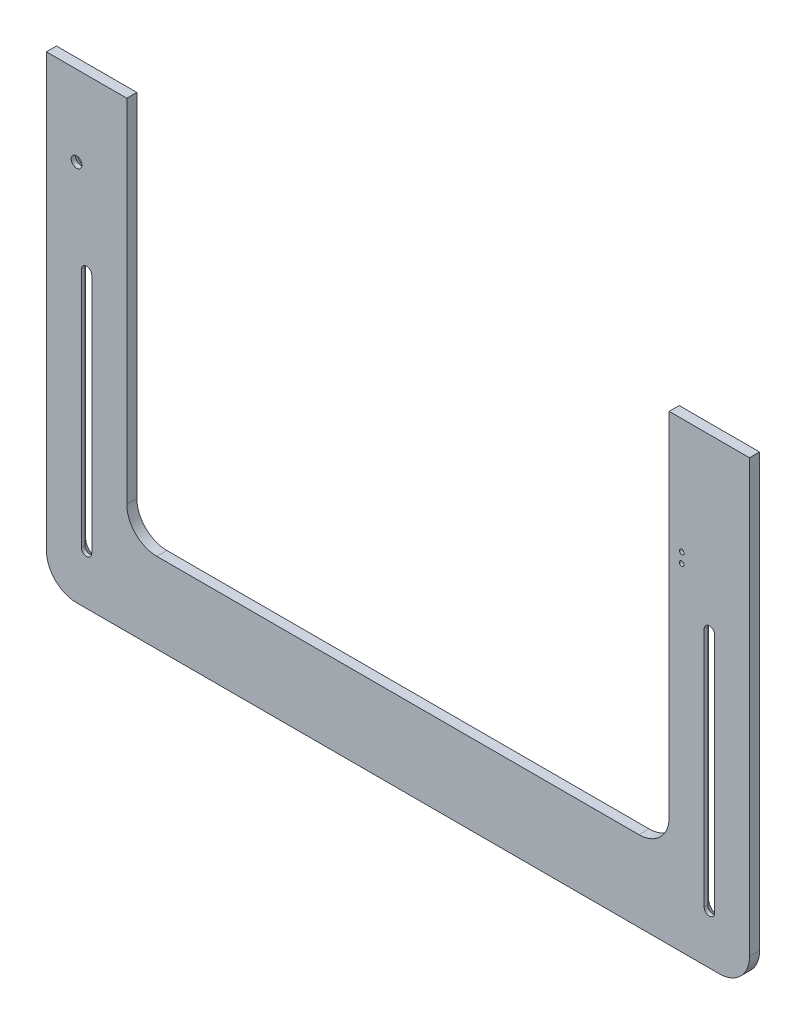
ISO-10303-21;
HEADER;
FILE_DESCRIPTION(('STEP AP214'),'2;1');
FILE_NAME('part.step','',(''),(''),'','','');
FILE_SCHEMA(('AUTOMOTIVE_DESIGN { 1 0 10303 214 1 1 1 1 }'));
ENDSEC;
DATA;
#1=APPLICATION_CONTEXT('core data for automotive mechanical design processes');
#2=APPLICATION_PROTOCOL_DEFINITION('international standard','automotive_design',2000,#1);
#3=PRODUCT_CONTEXT('',#1,'mechanical');
#4=PRODUCT('Part','Part','',(#3));
#5=PRODUCT_RELATED_PRODUCT_CATEGORY('part','',(#4));
#6=PRODUCT_DEFINITION_FORMATION('','',#4);
#7=PRODUCT_DEFINITION_CONTEXT('part definition',#1,'design');
#8=PRODUCT_DEFINITION('design','',#6,#7);
#9=PRODUCT_DEFINITION_SHAPE('','',#8);
#10=(LENGTH_UNIT() NAMED_UNIT(*) SI_UNIT(.MILLI.,.METRE.));
#11=(NAMED_UNIT(*) PLANE_ANGLE_UNIT() SI_UNIT($,.RADIAN.));
#12=(NAMED_UNIT(*) SI_UNIT($,.STERADIAN.) SOLID_ANGLE_UNIT());
#13=UNCERTAINTY_MEASURE_WITH_UNIT(LENGTH_MEASURE(1.E-05),#10,'distance_accuracy_value','');
#14=(GEOMETRIC_REPRESENTATION_CONTEXT(3) GLOBAL_UNCERTAINTY_ASSIGNED_CONTEXT((#13)) GLOBAL_UNIT_ASSIGNED_CONTEXT((#10,
#11,#12)) REPRESENTATION_CONTEXT('',''));
#15=CARTESIAN_POINT('',(0.,0.,0.));
#16=DIRECTION('',(0.,0.,1.));
#17=DIRECTION('',(1.,0.,0.));
#18=AXIS2_PLACEMENT_3D('',#15,#16,#17);
#19=CARTESIAN_POINT('',(374.65,-222.25,6.35));
#20=DIRECTION('',(0.,0.,1.));
#21=DIRECTION('',(1.,0.,0.));
#22=AXIS2_PLACEMENT_3D('',#19,#20,#21);
#23=CYLINDRICAL_SURFACE('',#22,19.05);
#24=DIRECTION('',(0.,0.,-1.));
#25=VECTOR('',#24,1.);
#26=CARTESIAN_POINT('',(374.65,-241.3,6.35));
#27=LINE('',#26,#25);
#28=CARTESIAN_POINT('',(374.65,-241.3,6.35));
#29=VERTEX_POINT('',#28);
#30=CARTESIAN_POINT('',(374.65,-241.3,0.));
#31=VERTEX_POINT('',#30);
#32=EDGE_CURVE('E362',#29,#31,#27,.T.);
#33=ORIENTED_EDGE('',*,*,#32,.F.);
#34=CARTESIAN_POINT('',(374.65,-222.25,6.35));
#35=DIRECTION('',(0.,0.,1.));
#36=DIRECTION('',(1.,0.,0.));
#37=AXIS2_PLACEMENT_3D('',#34,#35,#36);
#38=CIRCLE('',#37,19.05);
#39=CARTESIAN_POINT('',(393.7,-222.25,6.35));
#40=VERTEX_POINT('',#39);
#41=EDGE_CURVE('E368',#29,#40,#38,.T.);
#42=ORIENTED_EDGE('',*,*,#41,.T.);
#43=DIRECTION('',(0.,0.,-1.));
#44=VECTOR('',#43,1.);
#45=CARTESIAN_POINT('',(393.7,-222.25,6.35));
#46=LINE('',#45,#44);
#47=CARTESIAN_POINT('',(393.7,-222.25,0.));
#48=VERTEX_POINT('',#47);
#49=EDGE_CURVE('E365',#48,#40,#46,.F.);
#50=ORIENTED_EDGE('',*,*,#49,.F.);
#51=CARTESIAN_POINT('',(374.65,-222.25,0.));
#52=DIRECTION('',(0.,0.,1.));
#53=DIRECTION('',(1.,0.,0.));
#54=AXIS2_PLACEMENT_3D('',#51,#52,#53);
#55=CIRCLE('',#54,19.05);
#56=EDGE_CURVE('E370',#48,#31,#55,.F.);
#57=ORIENTED_EDGE('',*,*,#56,.T.);
#58=EDGE_LOOP('',(#33,#42,#50,#57));
#59=FACE_BOUND('',#58,.T.);
#60=ADVANCED_FACE('F39',(#59),#23,.F.);
#61=CARTESIAN_POINT('',(69.85,-222.25,6.35));
#62=DIRECTION('',(0.,0.,1.));
#63=DIRECTION('',(1.,0.,0.));
#64=AXIS2_PLACEMENT_3D('',#61,#62,#63);
#65=CYLINDRICAL_SURFACE('',#64,19.05);
#66=DIRECTION('',(0.,0.,-1.));
#67=VECTOR('',#66,1.);
#68=CARTESIAN_POINT('',(50.8,-222.25,6.35));
#69=LINE('',#68,#67);
#70=CARTESIAN_POINT('',(50.8,-222.25,6.35));
#71=VERTEX_POINT('',#70);
#72=CARTESIAN_POINT('',(50.8,-222.25,0.));
#73=VERTEX_POINT('',#72);
#74=EDGE_CURVE('E351',#71,#73,#69,.T.);
#75=ORIENTED_EDGE('',*,*,#74,.F.);
#76=CARTESIAN_POINT('',(69.85,-222.25,6.35));
#77=DIRECTION('',(0.,0.,1.));
#78=DIRECTION('',(1.,0.,0.));
#79=AXIS2_PLACEMENT_3D('',#76,#77,#78);
#80=CIRCLE('',#79,19.05);
#81=CARTESIAN_POINT('',(69.85,-241.3,6.35));
#82=VERTEX_POINT('',#81);
#83=EDGE_CURVE('E357',#71,#82,#80,.T.);
#84=ORIENTED_EDGE('',*,*,#83,.T.);
#85=DIRECTION('',(0.,0.,-1.));
#86=VECTOR('',#85,1.);
#87=CARTESIAN_POINT('',(69.85,-241.3,6.35));
#88=LINE('',#87,#86);
#89=CARTESIAN_POINT('',(69.85,-241.3,0.));
#90=VERTEX_POINT('',#89);
#91=EDGE_CURVE('E354',#90,#82,#88,.F.);
#92=ORIENTED_EDGE('',*,*,#91,.F.);
#93=CARTESIAN_POINT('',(69.85,-222.25,0.));
#94=DIRECTION('',(0.,0.,1.));
#95=DIRECTION('',(1.,0.,0.));
#96=AXIS2_PLACEMENT_3D('',#93,#94,#95);
#97=CIRCLE('',#96,19.05);
#98=EDGE_CURVE('E360',#90,#73,#97,.F.);
#99=ORIENTED_EDGE('',*,*,#98,.T.);
#100=EDGE_LOOP('',(#75,#84,#92,#99));
#101=FACE_BOUND('',#100,.T.);
#102=ADVANCED_FACE('F508',(#101),#65,.F.);
#103=CARTESIAN_POINT('',(425.45,-273.05,6.35));
#104=DIRECTION('',(0.,0.,1.));
#105=DIRECTION('',(1.,0.,0.));
#106=AXIS2_PLACEMENT_3D('',#103,#104,#105);
#107=CYLINDRICAL_SURFACE('',#106,19.05);
#108=DIRECTION('',(0.,0.,1.));
#109=VECTOR('',#108,1.);
#110=CARTESIAN_POINT('',(425.45,-292.1,6.35));
#111=LINE('',#110,#109);
#112=CARTESIAN_POINT('',(425.45,-292.1,0.));
#113=VERTEX_POINT('',#112);
#114=CARTESIAN_POINT('',(425.45,-292.1,6.35));
#115=VERTEX_POINT('',#114);
#116=EDGE_CURVE('E341',#113,#115,#111,.T.);
#117=ORIENTED_EDGE('',*,*,#116,.F.);
#118=CARTESIAN_POINT('',(425.45,-273.05,0.));
#119=DIRECTION('',(0.,0.,1.));
#120=DIRECTION('',(1.,0.,0.));
#121=AXIS2_PLACEMENT_3D('',#118,#119,#120);
#122=CIRCLE('',#121,19.05);
#123=CARTESIAN_POINT('',(444.5,-273.05,0.));
#124=VERTEX_POINT('',#123);
#125=EDGE_CURVE('E347',#124,#113,#122,.F.);
#126=ORIENTED_EDGE('',*,*,#125,.F.);
#127=DIRECTION('',(0.,0.,1.));
#128=VECTOR('',#127,1.);
#129=CARTESIAN_POINT('',(444.5,-273.05,6.35));
#130=LINE('',#129,#128);
#131=CARTESIAN_POINT('',(444.5,-273.05,6.35));
#132=VERTEX_POINT('',#131);
#133=EDGE_CURVE('E344',#132,#124,#130,.F.);
#134=ORIENTED_EDGE('',*,*,#133,.F.);
#135=CARTESIAN_POINT('',(425.45,-273.05,6.35));
#136=DIRECTION('',(0.,0.,1.));
#137=DIRECTION('',(1.,0.,0.));
#138=AXIS2_PLACEMENT_3D('',#135,#136,#137);
#139=CIRCLE('',#138,19.05);
#140=EDGE_CURVE('E349',#115,#132,#139,.T.);
#141=ORIENTED_EDGE('',*,*,#140,.F.);
#142=EDGE_LOOP('',(#117,#126,#134,#141));
#143=FACE_BOUND('',#142,.T.);
#144=ADVANCED_FACE('F484',(#143),#107,.T.);
#145=CARTESIAN_POINT('',(19.05,-273.05,6.35));
#146=DIRECTION('',(0.,0.,1.));
#147=DIRECTION('',(1.,0.,0.));
#148=AXIS2_PLACEMENT_3D('',#145,#146,#147);
#149=CYLINDRICAL_SURFACE('',#148,19.05);
#150=DIRECTION('',(0.,0.,1.));
#151=VECTOR('',#150,1.);
#152=CARTESIAN_POINT('',(0.,-273.05,6.35));
#153=LINE('',#152,#151);
#154=CARTESIAN_POINT('',(0.,-273.05,0.));
#155=VERTEX_POINT('',#154);
#156=CARTESIAN_POINT('',(0.,-273.05,6.35));
#157=VERTEX_POINT('',#156);
#158=EDGE_CURVE('E331',#155,#157,#153,.T.);
#159=ORIENTED_EDGE('',*,*,#158,.F.);
#160=CARTESIAN_POINT('',(19.05,-273.05,0.));
#161=DIRECTION('',(0.,0.,1.));
#162=DIRECTION('',(1.,0.,0.));
#163=AXIS2_PLACEMENT_3D('',#160,#161,#162);
#164=CIRCLE('',#163,19.05);
#165=CARTESIAN_POINT('',(19.05,-292.1,0.));
#166=VERTEX_POINT('',#165);
#167=EDGE_CURVE('E337',#166,#155,#164,.F.);
#168=ORIENTED_EDGE('',*,*,#167,.F.);
#169=DIRECTION('',(0.,0.,1.));
#170=VECTOR('',#169,1.);
#171=CARTESIAN_POINT('',(19.05,-292.1,6.35));
#172=LINE('',#171,#170);
#173=CARTESIAN_POINT('',(19.05,-292.1,6.35));
#174=VERTEX_POINT('',#173);
#175=EDGE_CURVE('E334',#174,#166,#172,.F.);
#176=ORIENTED_EDGE('',*,*,#175,.F.);
#177=CARTESIAN_POINT('',(19.05,-273.05,6.35));
#178=DIRECTION('',(0.,0.,1.));
#179=DIRECTION('',(1.,0.,0.));
#180=AXIS2_PLACEMENT_3D('',#177,#178,#179);
#181=CIRCLE('',#180,19.05);
#182=EDGE_CURVE('E339',#157,#174,#181,.T.);
#183=ORIENTED_EDGE('',*,*,#182,.F.);
#184=EDGE_LOOP('',(#159,#168,#176,#183));
#185=FACE_BOUND('',#184,.T.);
#186=ADVANCED_FACE('F491',(#185),#149,.T.);
#187=CARTESIAN_POINT('',(50.8,0.,6.35));
#188=DIRECTION('',(0.,-1.,0.));
#189=DIRECTION('',(1.,0.,0.));
#190=AXIS2_PLACEMENT_3D('',#187,#188,#189);
#191=PLANE('',#190);
#192=DIRECTION('',(-1.,0.,0.));
#193=VECTOR('',#192,1.);
#194=CARTESIAN_POINT('',(50.8,0.,0.));
#195=LINE('',#194,#193);
#196=CARTESIAN_POINT('',(50.8,0.,0.));
#197=VERTEX_POINT('',#196);
#198=CARTESIAN_POINT('',(0.,0.,0.));
#199=VERTEX_POINT('',#198);
#200=EDGE_CURVE('E264',#197,#199,#195,.T.);
#201=ORIENTED_EDGE('',*,*,#200,.T.);
#202=DIRECTION('',(0.,0.,-1.));
#203=VECTOR('',#202,1.);
#204=CARTESIAN_POINT('',(0.,0.,6.35));
#205=LINE('',#204,#203);
#206=CARTESIAN_POINT('',(0.,0.,6.35));
#207=VERTEX_POINT('',#206);
#208=EDGE_CURVE('E327',#207,#199,#205,.T.);
#209=ORIENTED_EDGE('',*,*,#208,.F.);
#210=DIRECTION('',(-1.,0.,0.));
#211=VECTOR('',#210,1.);
#212=CARTESIAN_POINT('',(50.8,0.,6.35));
#213=LINE('',#212,#211);
#214=CARTESIAN_POINT('',(50.8,0.,6.35));
#215=VERTEX_POINT('',#214);
#216=EDGE_CURVE('E272',#215,#207,#213,.T.);
#217=ORIENTED_EDGE('',*,*,#216,.F.);
#218=DIRECTION('',(0.,0.,-1.));
#219=VECTOR('',#218,1.);
#220=CARTESIAN_POINT('',(50.8,0.,6.35));
#221=LINE('',#220,#219);
#222=EDGE_CURVE('E296',#215,#197,#221,.T.);
#223=ORIENTED_EDGE('',*,*,#222,.T.);
#224=EDGE_LOOP('',(#201,#209,#217,#223));
#225=FACE_BOUND('',#224,.T.);
#226=ADVANCED_FACE('F497',(#225),#191,.F.);
#227=CARTESIAN_POINT('',(0.,0.,6.35));
#228=DIRECTION('',(1.,0.,0.));
#229=DIRECTION('',(0.,1.,0.));
#230=AXIS2_PLACEMENT_3D('',#227,#228,#229);
#231=PLANE('',#230);
#232=DIRECTION('',(0.,-1.,0.));
#233=VECTOR('',#232,1.);
#234=CARTESIAN_POINT('',(0.,0.,0.));
#235=LINE('',#234,#233);
#236=EDGE_CURVE('E300',#199,#155,#235,.T.);
#237=ORIENTED_EDGE('',*,*,#236,.T.);
#238=ORIENTED_EDGE('',*,*,#158,.T.);
#239=DIRECTION('',(0.,-1.,0.));
#240=VECTOR('',#239,1.);
#241=CARTESIAN_POINT('',(0.,0.,6.35));
#242=LINE('',#241,#240);
#243=EDGE_CURVE('E276',#207,#157,#242,.T.);
#244=ORIENTED_EDGE('',*,*,#243,.F.);
#245=ORIENTED_EDGE('',*,*,#208,.T.);
#246=EDGE_LOOP('',(#237,#238,#244,#245));
#247=FACE_BOUND('',#246,.T.);
#248=ADVANCED_FACE('F493',(#247),#231,.F.);
#249=CARTESIAN_POINT('',(0.,-292.1,6.35));
#250=DIRECTION('',(0.,1.,0.));
#251=DIRECTION('',(0.,0.,1.));
#252=AXIS2_PLACEMENT_3D('',#249,#250,#251);
#253=PLANE('',#252);
#254=DIRECTION('',(1.,0.,0.));
#255=VECTOR('',#254,1.);
#256=CARTESIAN_POINT('',(0.,-292.1,0.));
#257=LINE('',#256,#255);
#258=EDGE_CURVE('E304',#166,#113,#257,.T.);
#259=ORIENTED_EDGE('',*,*,#258,.T.);
#260=ORIENTED_EDGE('',*,*,#116,.T.);
#261=DIRECTION('',(1.,0.,0.));
#262=VECTOR('',#261,1.);
#263=CARTESIAN_POINT('',(0.,-292.1,6.35));
#264=LINE('',#263,#262);
#265=EDGE_CURVE('E281',#174,#115,#264,.T.);
#266=ORIENTED_EDGE('',*,*,#265,.F.);
#267=ORIENTED_EDGE('',*,*,#175,.T.);
#268=EDGE_LOOP('',(#259,#260,#266,#267));
#269=FACE_BOUND('',#268,.T.);
#270=ADVANCED_FACE('F486',(#269),#253,.F.);
#271=CARTESIAN_POINT('',(444.5,-292.1,6.35));
#272=DIRECTION('',(-1.,0.,0.));
#273=DIRECTION('',(0.,0.,1.));
#274=AXIS2_PLACEMENT_3D('',#271,#272,#273);
#275=PLANE('',#274);
#276=DIRECTION('',(0.,1.,0.));
#277=VECTOR('',#276,1.);
#278=CARTESIAN_POINT('',(444.5,-292.1,6.35));
#279=LINE('',#278,#277);
#280=CARTESIAN_POINT('',(444.5,0.,6.35));
#281=VERTEX_POINT('',#280);
#282=EDGE_CURVE('E284',#132,#281,#279,.T.);
#283=ORIENTED_EDGE('',*,*,#282,.F.);
#284=ORIENTED_EDGE('',*,*,#133,.T.);
#285=DIRECTION('',(0.,1.,0.));
#286=VECTOR('',#285,1.);
#287=CARTESIAN_POINT('',(444.5,-292.1,0.));
#288=LINE('',#287,#286);
#289=CARTESIAN_POINT('',(444.5,0.,0.));
#290=VERTEX_POINT('',#289);
#291=EDGE_CURVE('E307',#124,#290,#288,.T.);
#292=ORIENTED_EDGE('',*,*,#291,.T.);
#293=DIRECTION('',(0.,0.,-1.));
#294=VECTOR('',#293,1.);
#295=CARTESIAN_POINT('',(444.5,0.,6.35));
#296=LINE('',#295,#294);
#297=EDGE_CURVE('E324',#281,#290,#296,.T.);
#298=ORIENTED_EDGE('',*,*,#297,.F.);
#299=EDGE_LOOP('',(#283,#284,#292,#298));
#300=FACE_BOUND('',#299,.T.);
#301=ADVANCED_FACE('F474',(#300),#275,.F.);
#302=CARTESIAN_POINT('',(444.5,0.,6.35));
#303=DIRECTION('',(0.,-1.,0.));
#304=DIRECTION('',(1.,0.,0.));
#305=AXIS2_PLACEMENT_3D('',#302,#303,#304);
#306=PLANE('',#305);
#307=DIRECTION('',(-1.,0.,0.));
#308=VECTOR('',#307,1.);
#309=CARTESIAN_POINT('',(444.5,0.,0.));
#310=LINE('',#309,#308);
#311=CARTESIAN_POINT('',(393.7,0.,0.));
#312=VERTEX_POINT('',#311);
#313=EDGE_CURVE('E309',#290,#312,#310,.T.);
#314=ORIENTED_EDGE('',*,*,#313,.T.);
#315=DIRECTION('',(0.,0.,-1.));
#316=VECTOR('',#315,1.);
#317=CARTESIAN_POINT('',(393.7,0.,6.35));
#318=LINE('',#317,#316);
#319=CARTESIAN_POINT('',(393.7,0.,6.35));
#320=VERTEX_POINT('',#319);
#321=EDGE_CURVE('E321',#320,#312,#318,.T.);
#322=ORIENTED_EDGE('',*,*,#321,.F.);
#323=DIRECTION('',(-1.,0.,0.));
#324=VECTOR('',#323,1.);
#325=CARTESIAN_POINT('',(444.5,0.,6.35));
#326=LINE('',#325,#324);
#327=EDGE_CURVE('E286',#281,#320,#326,.T.);
#328=ORIENTED_EDGE('',*,*,#327,.F.);
#329=ORIENTED_EDGE('',*,*,#297,.T.);
#330=EDGE_LOOP('',(#314,#322,#328,#329));
#331=FACE_BOUND('',#330,.T.);
#332=ADVANCED_FACE('F478',(#331),#306,.F.);
#333=CARTESIAN_POINT('',(393.7,0.,6.35));
#334=DIRECTION('',(1.,0.,0.));
#335=DIRECTION('',(0.,1.,0.));
#336=AXIS2_PLACEMENT_3D('',#333,#334,#335);
#337=PLANE('',#336);
#338=DIRECTION('',(0.,-1.,0.));
#339=VECTOR('',#338,1.);
#340=CARTESIAN_POINT('',(393.7,0.,0.));
#341=LINE('',#340,#339);
#342=EDGE_CURVE('E311',#312,#48,#341,.T.);
#343=ORIENTED_EDGE('',*,*,#342,.T.);
#344=ORIENTED_EDGE('',*,*,#49,.T.);
#345=DIRECTION('',(0.,-1.,0.));
#346=VECTOR('',#345,1.);
#347=CARTESIAN_POINT('',(393.7,0.,6.35));
#348=LINE('',#347,#346);
#349=EDGE_CURVE('E288',#320,#40,#348,.T.);
#350=ORIENTED_EDGE('',*,*,#349,.F.);
#351=ORIENTED_EDGE('',*,*,#321,.T.);
#352=EDGE_LOOP('',(#343,#344,#350,#351));
#353=FACE_BOUND('',#352,.T.);
#354=ADVANCED_FACE('F516',(#353),#337,.F.);
#355=CARTESIAN_POINT('',(393.7,-241.3,6.35));
#356=DIRECTION('',(0.,-1.,0.));
#357=DIRECTION('',(1.,0.,0.));
#358=AXIS2_PLACEMENT_3D('',#355,#356,#357);
#359=PLANE('',#358);
#360=DIRECTION('',(-1.,0.,0.));
#361=VECTOR('',#360,1.);
#362=CARTESIAN_POINT('',(393.7,-241.3,6.35));
#363=LINE('',#362,#361);
#364=EDGE_CURVE('E291',#29,#82,#363,.T.);
#365=ORIENTED_EDGE('',*,*,#364,.F.);
#366=ORIENTED_EDGE('',*,*,#32,.T.);
#367=DIRECTION('',(-1.,0.,0.));
#368=VECTOR('',#367,1.);
#369=CARTESIAN_POINT('',(393.7,-241.3,0.));
#370=LINE('',#369,#368);
#371=EDGE_CURVE('E314',#31,#90,#370,.T.);
#372=ORIENTED_EDGE('',*,*,#371,.T.);
#373=ORIENTED_EDGE('',*,*,#91,.T.);
#374=EDGE_LOOP('',(#365,#366,#372,#373));
#375=FACE_BOUND('',#374,.T.);
#376=ADVANCED_FACE('F511',(#375),#359,.F.);
#377=CARTESIAN_POINT('',(50.8,-241.3,6.35));
#378=DIRECTION('',(-1.,0.,0.));
#379=DIRECTION('',(0.,-1.,0.));
#380=AXIS2_PLACEMENT_3D('',#377,#378,#379);
#381=PLANE('',#380);
#382=DIRECTION('',(0.,1.,0.));
#383=VECTOR('',#382,1.);
#384=CARTESIAN_POINT('',(50.8,-241.3,6.35));
#385=LINE('',#384,#383);
#386=EDGE_CURVE('E293',#71,#215,#385,.T.);
#387=ORIENTED_EDGE('',*,*,#386,.F.);
#388=ORIENTED_EDGE('',*,*,#74,.T.);
#389=DIRECTION('',(0.,1.,0.));
#390=VECTOR('',#389,1.);
#391=CARTESIAN_POINT('',(50.8,-241.3,0.));
#392=LINE('',#391,#390);
#393=EDGE_CURVE('E277',#73,#197,#392,.T.);
#394=ORIENTED_EDGE('',*,*,#393,.T.);
#395=ORIENTED_EDGE('',*,*,#222,.F.);
#396=EDGE_LOOP('',(#387,#388,#394,#395));
#397=FACE_BOUND('',#396,.T.);
#398=ADVANCED_FACE('F505',(#397),#381,.F.);
#399=CARTESIAN_POINT('',(0.,0.,6.35));
#400=DIRECTION('',(0.,0.,1.));
#401=DIRECTION('',(1.,0.,0.));
#402=AXIS2_PLACEMENT_3D('',#399,#400,#401);
#403=PLANE('',#402);
#404=CARTESIAN_POINT('',(401.637499999999,-73.0249999999991,6.35));
#405=DIRECTION('',(0.,0.,1.));
#406=DIRECTION('',(1.,0.,0.));
#407=AXIS2_PLACEMENT_3D('',#404,#405,#406);
#408=CIRCLE('',#407,1.47320000000001);
#409=CARTESIAN_POINT('',(403.110699999999,-73.0249999999991,6.35));
#410=VERTEX_POINT('',#409);
#411=EDGE_CURVE('E774',#410,#410,#408,.T.);
#412=ORIENTED_EDGE('',*,*,#411,.F.);
#413=EDGE_LOOP('',(#412));
#414=FACE_BOUND('',#413,.T.);
#415=CARTESIAN_POINT('',(401.637499999999,-79.3749999999991,6.35));
#416=DIRECTION('',(0.,0.,1.));
#417=DIRECTION('',(1.,0.,0.));
#418=AXIS2_PLACEMENT_3D('',#415,#416,#417);
#419=CIRCLE('',#418,1.47320000000001);
#420=CARTESIAN_POINT('',(403.110699999999,-79.3749999999991,6.35));
#421=VERTEX_POINT('',#420);
#422=EDGE_CURVE('E778',#421,#421,#419,.T.);
#423=ORIENTED_EDGE('',*,*,#422,.F.);
#424=EDGE_LOOP('',(#423));
#425=FACE_BOUND('',#424,.T.);
#426=CARTESIAN_POINT('',(19.0499999999999,-50.7999999999991,6.35));
#427=DIRECTION('',(0.,0.,-1.));
#428=DIRECTION('',(-1.,0.,0.));
#429=AXIS2_PLACEMENT_3D('',#426,#427,#428);
#430=CIRCLE('',#429,3.3782);
#431=CARTESIAN_POINT('',(15.6717999999999,-50.7999999999991,6.35));
#432=VERTEX_POINT('',#431);
#433=EDGE_CURVE('E790',#432,#432,#430,.T.);
#434=ORIENTED_EDGE('',*,*,#433,.T.);
#435=EDGE_LOOP('',(#434));
#436=FACE_BOUND('',#435,.T.);
#437=CARTESIAN_POINT('',(419.1,-260.35,6.35));
#438=DIRECTION('',(0.,0.,1.));
#439=DIRECTION('',(1.,0.,0.));
#440=AXIS2_PLACEMENT_3D('',#437,#438,#439);
#441=CIRCLE('',#440,3.26389999999999);
#442=CARTESIAN_POINT('',(415.8361,-260.35,6.35));
#443=VERTEX_POINT('',#442);
#444=CARTESIAN_POINT('',(422.3639,-260.35,6.35));
#445=VERTEX_POINT('',#444);
#446=EDGE_CURVE('E232',#443,#445,#441,.T.);
#447=ORIENTED_EDGE('',*,*,#446,.F.);
#448=DIRECTION('',(0.,-1.,0.));
#449=VECTOR('',#448,1.);
#450=CARTESIAN_POINT('',(415.8361,-260.35,6.35));
#451=LINE('',#450,#449);
#452=CARTESIAN_POINT('',(415.8361,-107.95,6.35));
#453=VERTEX_POINT('',#452);
#454=EDGE_CURVE('E237',#453,#443,#451,.T.);
#455=ORIENTED_EDGE('',*,*,#454,.F.);
#456=CARTESIAN_POINT('',(419.1,-107.95,6.35));
#457=DIRECTION('',(0.,0.,1.));
#458=DIRECTION('',(1.,0.,0.));
#459=AXIS2_PLACEMENT_3D('',#456,#457,#458);
#460=CIRCLE('',#459,3.26389999999999);
#461=CARTESIAN_POINT('',(422.3639,-107.95,6.35));
#462=VERTEX_POINT('',#461);
#463=EDGE_CURVE('E217',#462,#453,#460,.T.);
#464=ORIENTED_EDGE('',*,*,#463,.F.);
#465=DIRECTION('',(0.,1.,0.));
#466=VECTOR('',#465,1.);
#467=CARTESIAN_POINT('',(422.3639,-260.35,6.35));
#468=LINE('',#467,#466);
#469=EDGE_CURVE('E226',#445,#462,#468,.T.);
#470=ORIENTED_EDGE('',*,*,#469,.F.);
#471=EDGE_LOOP('',(#447,#455,#464,#470));
#472=FACE_BOUND('',#471,.T.);
#473=CARTESIAN_POINT('',(25.4,-260.35,6.35));
#474=DIRECTION('',(0.,0.,1.));
#475=DIRECTION('',(1.,0.,0.));
#476=AXIS2_PLACEMENT_3D('',#473,#474,#475);
#477=CIRCLE('',#476,3.2639);
#478=CARTESIAN_POINT('',(22.1361,-260.35,6.35));
#479=VERTEX_POINT('',#478);
#480=CARTESIAN_POINT('',(28.6639,-260.35,6.35));
#481=VERTEX_POINT('',#480);
#482=EDGE_CURVE('E244',#479,#481,#477,.T.);
#483=ORIENTED_EDGE('',*,*,#482,.F.);
#484=DIRECTION('',(0.,1.,0.));
#485=VECTOR('',#484,1.);
#486=CARTESIAN_POINT('',(22.1361,-260.35,6.35));
#487=LINE('',#486,#485);
#488=CARTESIAN_POINT('',(22.1361,-107.95,6.35));
#489=VERTEX_POINT('',#488);
#490=EDGE_CURVE('E257',#479,#489,#487,.T.);
#491=ORIENTED_EDGE('',*,*,#490,.T.);
#492=CARTESIAN_POINT('',(25.4,-107.95,6.35));
#493=DIRECTION('',(0.,0.,1.));
#494=DIRECTION('',(1.,0.,0.));
#495=AXIS2_PLACEMENT_3D('',#492,#493,#494);
#496=CIRCLE('',#495,3.2639);
#497=CARTESIAN_POINT('',(28.6639,-107.95,6.35));
#498=VERTEX_POINT('',#497);
#499=EDGE_CURVE('E253',#498,#489,#496,.T.);
#500=ORIENTED_EDGE('',*,*,#499,.F.);
#501=DIRECTION('',(0.,1.,0.));
#502=VECTOR('',#501,1.);
#503=CARTESIAN_POINT('',(28.6639,-260.35,6.35));
#504=LINE('',#503,#502);
#505=EDGE_CURVE('E249',#481,#498,#504,.T.);
#506=ORIENTED_EDGE('',*,*,#505,.F.);
#507=EDGE_LOOP('',(#483,#491,#500,#506));
#508=FACE_BOUND('',#507,.T.);
#509=ORIENTED_EDGE('',*,*,#41,.F.);
#510=ORIENTED_EDGE('',*,*,#364,.T.);
#511=ORIENTED_EDGE('',*,*,#83,.F.);
#512=ORIENTED_EDGE('',*,*,#386,.T.);
#513=ORIENTED_EDGE('',*,*,#216,.T.);
#514=ORIENTED_EDGE('',*,*,#243,.T.);
#515=ORIENTED_EDGE('',*,*,#182,.T.);
#516=ORIENTED_EDGE('',*,*,#265,.T.);
#517=ORIENTED_EDGE('',*,*,#140,.T.);
#518=ORIENTED_EDGE('',*,*,#282,.T.);
#519=ORIENTED_EDGE('',*,*,#327,.T.);
#520=ORIENTED_EDGE('',*,*,#349,.T.);
#521=EDGE_LOOP('',(#509,#510,#511,#512,#513,#514,#515,#516,#517,#518,#519,#520));
#522=FACE_BOUND('',#521,.T.);
#523=ADVANCED_FACE('F234',(#414,#425,#436,#472,#508,#522),#403,.T.);
#524=CARTESIAN_POINT('',(0.,0.,0.));
#525=DIRECTION('',(0.,0.,1.));
#526=DIRECTION('',(1.,0.,0.));
#527=AXIS2_PLACEMENT_3D('',#524,#525,#526);
#528=PLANE('',#527);
#529=CARTESIAN_POINT('',(401.637499999999,-73.0249999999991,0.));
#530=DIRECTION('',(0.,0.,1.));
#531=DIRECTION('',(1.,0.,0.));
#532=AXIS2_PLACEMENT_3D('',#529,#530,#531);
#533=CIRCLE('',#532,1.47320000000001);
#534=CARTESIAN_POINT('',(403.110699999999,-73.0249999999991,0.));
#535=VERTEX_POINT('',#534);
#536=EDGE_CURVE('E777',#535,#535,#533,.T.);
#537=ORIENTED_EDGE('',*,*,#536,.T.);
#538=EDGE_LOOP('',(#537));
#539=FACE_BOUND('',#538,.T.);
#540=CARTESIAN_POINT('',(401.637499999999,-79.3749999999991,0.));
#541=DIRECTION('',(0.,0.,1.));
#542=DIRECTION('',(1.,0.,0.));
#543=AXIS2_PLACEMENT_3D('',#540,#541,#542);
#544=CIRCLE('',#543,1.47320000000001);
#545=CARTESIAN_POINT('',(403.110699999999,-79.3749999999991,0.));
#546=VERTEX_POINT('',#545);
#547=EDGE_CURVE('E43',#546,#546,#544,.T.);
#548=ORIENTED_EDGE('',*,*,#547,.T.);
#549=EDGE_LOOP('',(#548));
#550=FACE_BOUND('',#549,.T.);
#551=DIRECTION('',(0.,1.,0.));
#552=VECTOR('',#551,1.);
#553=CARTESIAN_POINT('',(32.3460122987517,0.,0.));
#554=LINE('',#553,#552);
#555=CARTESIAN_POINT('',(32.3460122987517,-260.35,0.));
#556=VERTEX_POINT('',#555);
#557=CARTESIAN_POINT('',(32.3460122987517,-107.95,0.));
#558=VERTEX_POINT('',#557);
#559=EDGE_CURVE('E388',#556,#558,#554,.T.);
#560=ORIENTED_EDGE('',*,*,#559,.T.);
#561=CARTESIAN_POINT('',(25.4,-107.95,0.));
#562=DIRECTION('',(0.,0.,1.));
#563=DIRECTION('',(1.,0.,0.));
#564=AXIS2_PLACEMENT_3D('',#561,#562,#563);
#565=CIRCLE('',#564,6.9460122987517);
#566=CARTESIAN_POINT('',(18.4539877012483,-107.95,0.));
#567=VERTEX_POINT('',#566);
#568=EDGE_CURVE('E408',#558,#567,#565,.T.);
#569=ORIENTED_EDGE('',*,*,#568,.T.);
#570=DIRECTION('',(0.,-1.,0.));
#571=VECTOR('',#570,1.);
#572=CARTESIAN_POINT('',(18.4539877012483,-260.35,0.));
#573=LINE('',#572,#571);
#574=CARTESIAN_POINT('',(18.4539877012483,-260.35,0.));
#575=VERTEX_POINT('',#574);
#576=EDGE_CURVE('E405',#567,#575,#573,.T.);
#577=ORIENTED_EDGE('',*,*,#576,.T.);
#578=CARTESIAN_POINT('',(25.4,-260.35,0.));
#579=DIRECTION('',(0.,0.,1.));
#580=DIRECTION('',(1.,0.,0.));
#581=AXIS2_PLACEMENT_3D('',#578,#579,#580);
#582=CIRCLE('',#581,6.94601229875171);
#583=EDGE_CURVE('E403',#575,#556,#582,.T.);
#584=ORIENTED_EDGE('',*,*,#583,.T.);
#585=EDGE_LOOP('',(#560,#569,#577,#584));
#586=FACE_BOUND('',#585,.T.);
#587=DIRECTION('',(0.,1.,0.));
#588=VECTOR('',#587,1.);
#589=CARTESIAN_POINT('',(426.046012298752,0.,0.));
#590=LINE('',#589,#588);
#591=CARTESIAN_POINT('',(426.046012298752,-260.35,0.));
#592=VERTEX_POINT('',#591);
#593=CARTESIAN_POINT('',(426.046012298752,-107.95,0.));
#594=VERTEX_POINT('',#593);
#595=EDGE_CURVE('E372',#592,#594,#590,.T.);
#596=ORIENTED_EDGE('',*,*,#595,.T.);
#597=CARTESIAN_POINT('',(419.1,-107.95,0.));
#598=DIRECTION('',(0.,0.,1.));
#599=DIRECTION('',(1.,0.,0.));
#600=AXIS2_PLACEMENT_3D('',#597,#598,#599);
#601=CIRCLE('',#600,6.94601229875158);
#602=CARTESIAN_POINT('',(412.153987701249,-107.95,0.));
#603=VERTEX_POINT('',#602);
#604=EDGE_CURVE('E378',#594,#603,#601,.T.);
#605=ORIENTED_EDGE('',*,*,#604,.T.);
#606=DIRECTION('',(0.,-1.,0.));
#607=VECTOR('',#606,1.);
#608=CARTESIAN_POINT('',(412.153987701249,0.,0.));
#609=LINE('',#608,#607);
#610=CARTESIAN_POINT('',(412.153987701249,-260.35,0.));
#611=VERTEX_POINT('',#610);
#612=EDGE_CURVE('E376',#603,#611,#609,.T.);
#613=ORIENTED_EDGE('',*,*,#612,.T.);
#614=CARTESIAN_POINT('',(419.1,-260.35,0.));
#615=DIRECTION('',(0.,0.,1.));
#616=DIRECTION('',(1.,0.,0.));
#617=AXIS2_PLACEMENT_3D('',#614,#615,#616);
#618=CIRCLE('',#617,6.94601229875158);
#619=EDGE_CURVE('E374',#611,#592,#618,.T.);
#620=ORIENTED_EDGE('',*,*,#619,.T.);
#621=EDGE_LOOP('',(#596,#605,#613,#620));
#622=FACE_BOUND('',#621,.T.);
#623=CARTESIAN_POINT('',(19.0499999999999,-50.7999999999991,0.));
#624=DIRECTION('',(0.,0.,-1.));
#625=DIRECTION('',(-1.,0.,0.));
#626=AXIS2_PLACEMENT_3D('',#623,#624,#625);
#627=CIRCLE('',#626,6.4389);
#628=CARTESIAN_POINT('',(12.6110999999999,-50.7999999999991,0.));
#629=VERTEX_POINT('',#628);
#630=EDGE_CURVE('E400',#629,#629,#627,.T.);
#631=ORIENTED_EDGE('',*,*,#630,.F.);
#632=EDGE_LOOP('',(#631));
#633=FACE_BOUND('',#632,.T.);
#634=ORIENTED_EDGE('',*,*,#291,.F.);
#635=ORIENTED_EDGE('',*,*,#125,.T.);
#636=ORIENTED_EDGE('',*,*,#258,.F.);
#637=ORIENTED_EDGE('',*,*,#167,.T.);
#638=ORIENTED_EDGE('',*,*,#236,.F.);
#639=ORIENTED_EDGE('',*,*,#200,.F.);
#640=ORIENTED_EDGE('',*,*,#393,.F.);
#641=ORIENTED_EDGE('',*,*,#98,.F.);
#642=ORIENTED_EDGE('',*,*,#371,.F.);
#643=ORIENTED_EDGE('',*,*,#56,.F.);
#644=ORIENTED_EDGE('',*,*,#342,.F.);
#645=ORIENTED_EDGE('',*,*,#313,.F.);
#646=EDGE_LOOP('',(#634,#635,#636,#637,#638,#639,#640,#641,#642,#643,#644,#645));
#647=FACE_BOUND('',#646,.T.);
#648=ADVANCED_FACE('F454',(#539,#550,#586,#622,#633,#647),#528,.F.);
#649=CARTESIAN_POINT('',(25.4,-260.35,0.));
#650=DIRECTION('',(0.,0.,1.));
#651=DIRECTION('',(1.,0.,0.));
#652=AXIS2_PLACEMENT_3D('',#649,#650,#651);
#653=CYLINDRICAL_SURFACE('',#652,3.2639);
#654=DIRECTION('',(0.,0.,1.));
#655=VECTOR('',#654,1.);
#656=CARTESIAN_POINT('',(28.6639,-260.35,0.));
#657=LINE('',#656,#655);
#658=CARTESIAN_POINT('',(28.6639,-260.35,4.08940000000013));
#659=VERTEX_POINT('',#658);
#660=EDGE_CURVE('E261',#659,#481,#657,.T.);
#661=ORIENTED_EDGE('',*,*,#660,.F.);
#662=CARTESIAN_POINT('',(25.4,-260.35,4.08940000000013));
#663=DIRECTION('',(0.,0.,1.));
#664=DIRECTION('',(1.,0.,0.));
#665=AXIS2_PLACEMENT_3D('',#662,#663,#664);
#666=CIRCLE('',#665,3.2639);
#667=CARTESIAN_POINT('',(22.1361,-260.35,4.08940000000013));
#668=VERTEX_POINT('',#667);
#669=EDGE_CURVE('E49',#659,#668,#666,.F.);
#670=ORIENTED_EDGE('',*,*,#669,.T.);
#671=DIRECTION('',(0.,0.,1.));
#672=VECTOR('',#671,1.);
#673=CARTESIAN_POINT('',(22.1361,-260.35,0.));
#674=LINE('',#673,#672);
#675=EDGE_CURVE('E262',#668,#479,#674,.T.);
#676=ORIENTED_EDGE('',*,*,#675,.T.);
#677=ORIENTED_EDGE('',*,*,#482,.T.);
#678=EDGE_LOOP('',(#661,#670,#676,#677));
#679=FACE_BOUND('',#678,.T.);
#680=ADVANCED_FACE('F457',(#679),#653,.F.);
#681=CARTESIAN_POINT('',(22.1361,-260.35,0.));
#682=DIRECTION('',(1.,0.,0.));
#683=DIRECTION('',(0.,1.,0.));
#684=AXIS2_PLACEMENT_3D('',#681,#682,#683);
#685=PLANE('',#684);
#686=ORIENTED_EDGE('',*,*,#675,.F.);
#687=DIRECTION('',(0.,1.,0.));
#688=VECTOR('',#687,1.);
#689=CARTESIAN_POINT('',(22.1361,-107.95,4.08940000000013));
#690=LINE('',#689,#688);
#691=CARTESIAN_POINT('',(22.1361,-107.95,4.08940000000013));
#692=VERTEX_POINT('',#691);
#693=EDGE_CURVE('E416',#668,#692,#690,.T.);
#694=ORIENTED_EDGE('',*,*,#693,.T.);
#695=DIRECTION('',(0.,0.,1.));
#696=VECTOR('',#695,1.);
#697=CARTESIAN_POINT('',(22.1361,-107.95,0.));
#698=LINE('',#697,#696);
#699=EDGE_CURVE('E265',#692,#489,#698,.T.);
#700=ORIENTED_EDGE('',*,*,#699,.T.);
#701=ORIENTED_EDGE('',*,*,#490,.F.);
#702=EDGE_LOOP('',(#686,#694,#700,#701));
#703=FACE_BOUND('',#702,.T.);
#704=ADVANCED_FACE('F444',(#703),#685,.T.);
#705=CARTESIAN_POINT('',(25.4,-107.95,0.));
#706=DIRECTION('',(0.,0.,1.));
#707=DIRECTION('',(1.,0.,0.));
#708=AXIS2_PLACEMENT_3D('',#705,#706,#707);
#709=CYLINDRICAL_SURFACE('',#708,3.2639);
#710=ORIENTED_EDGE('',*,*,#699,.F.);
#711=CARTESIAN_POINT('',(25.4,-107.95,4.08940000000013));
#712=DIRECTION('',(0.,0.,1.));
#713=DIRECTION('',(1.,0.,0.));
#714=AXIS2_PLACEMENT_3D('',#711,#712,#713);
#715=CIRCLE('',#714,3.2639);
#716=CARTESIAN_POINT('',(28.6639,-107.95,4.08940000000013));
#717=VERTEX_POINT('',#716);
#718=EDGE_CURVE('E412',#692,#717,#715,.F.);
#719=ORIENTED_EDGE('',*,*,#718,.T.);
#720=DIRECTION('',(0.,0.,1.));
#721=VECTOR('',#720,1.);
#722=CARTESIAN_POINT('',(28.6639,-107.95,0.));
#723=LINE('',#722,#721);
#724=EDGE_CURVE('E268',#717,#498,#723,.T.);
#725=ORIENTED_EDGE('',*,*,#724,.T.);
#726=ORIENTED_EDGE('',*,*,#499,.T.);
#727=EDGE_LOOP('',(#710,#719,#725,#726));
#728=FACE_BOUND('',#727,.T.);
#729=ADVANCED_FACE('F448',(#728),#709,.F.);
#730=CARTESIAN_POINT('',(28.6639,-260.35,0.));
#731=DIRECTION('',(1.,0.,0.));
#732=DIRECTION('',(0.,1.,0.));
#733=AXIS2_PLACEMENT_3D('',#730,#731,#732);
#734=PLANE('',#733);
#735=ORIENTED_EDGE('',*,*,#724,.F.);
#736=DIRECTION('',(0.,-1.,0.));
#737=VECTOR('',#736,1.);
#738=CARTESIAN_POINT('',(28.6639,-260.35,4.08940000000013));
#739=LINE('',#738,#737);
#740=EDGE_CURVE('E11',#717,#659,#739,.T.);
#741=ORIENTED_EDGE('',*,*,#740,.T.);
#742=ORIENTED_EDGE('',*,*,#660,.T.);
#743=ORIENTED_EDGE('',*,*,#505,.T.);
#744=EDGE_LOOP('',(#735,#741,#742,#743));
#745=FACE_BOUND('',#744,.T.);
#746=ADVANCED_FACE('F628',(#745),#734,.F.);
#747=CARTESIAN_POINT('',(419.1,-260.35,0.));
#748=DIRECTION('',(0.,0.,1.));
#749=DIRECTION('',(1.,0.,0.));
#750=AXIS2_PLACEMENT_3D('',#747,#748,#749);
#751=CYLINDRICAL_SURFACE('',#750,3.26389999999999);
#752=DIRECTION('',(0.,0.,1.));
#753=VECTOR('',#752,1.);
#754=CARTESIAN_POINT('',(422.3639,-260.35,0.));
#755=LINE('',#754,#753);
#756=CARTESIAN_POINT('',(422.3639,-260.35,4.08939999999997));
#757=VERTEX_POINT('',#756);
#758=EDGE_CURVE('E223',#757,#445,#755,.T.);
#759=ORIENTED_EDGE('',*,*,#758,.F.);
#760=CARTESIAN_POINT('',(419.1,-260.35,4.08939999999996));
#761=DIRECTION('',(0.,0.,1.));
#762=DIRECTION('',(1.,0.,0.));
#763=AXIS2_PLACEMENT_3D('',#760,#761,#762);
#764=CIRCLE('',#763,3.26389999999999);
#765=CARTESIAN_POINT('',(415.8361,-260.35,4.08939999999996));
#766=VERTEX_POINT('',#765);
#767=EDGE_CURVE('E384',#757,#766,#764,.F.);
#768=ORIENTED_EDGE('',*,*,#767,.T.);
#769=DIRECTION('',(0.,0.,1.));
#770=VECTOR('',#769,1.);
#771=CARTESIAN_POINT('',(415.8361,-260.35,0.));
#772=LINE('',#771,#770);
#773=EDGE_CURVE('E242',#766,#443,#772,.T.);
#774=ORIENTED_EDGE('',*,*,#773,.T.);
#775=ORIENTED_EDGE('',*,*,#446,.T.);
#776=EDGE_LOOP('',(#759,#768,#774,#775));
#777=FACE_BOUND('',#776,.T.);
#778=ADVANCED_FACE('F619',(#777),#751,.F.);
#779=CARTESIAN_POINT('',(415.8361,-260.35,0.));
#780=DIRECTION('',(-1.,0.,0.));
#781=DIRECTION('',(0.,0.,1.));
#782=AXIS2_PLACEMENT_3D('',#779,#780,#781);
#783=PLANE('',#782);
#784=ORIENTED_EDGE('',*,*,#773,.F.);
#785=DIRECTION('',(0.,1.,0.));
#786=VECTOR('',#785,1.);
#787=CARTESIAN_POINT('',(415.8361,-260.35,4.08939999999997));
#788=LINE('',#787,#786);
#789=CARTESIAN_POINT('',(415.8361,-107.95,4.08939999999997));
#790=VERTEX_POINT('',#789);
#791=EDGE_CURVE('E382',#766,#790,#788,.T.);
#792=ORIENTED_EDGE('',*,*,#791,.T.);
#793=DIRECTION('',(0.,0.,1.));
#794=VECTOR('',#793,1.);
#795=CARTESIAN_POINT('',(415.8361,-107.95,0.));
#796=LINE('',#795,#794);
#797=EDGE_CURVE('E222',#790,#453,#796,.T.);
#798=ORIENTED_EDGE('',*,*,#797,.T.);
#799=ORIENTED_EDGE('',*,*,#454,.T.);
#800=EDGE_LOOP('',(#784,#792,#798,#799));
#801=FACE_BOUND('',#800,.T.);
#802=ADVANCED_FACE('F610',(#801),#783,.F.);
#803=CARTESIAN_POINT('',(419.1,-107.95,0.));
#804=DIRECTION('',(0.,0.,1.));
#805=DIRECTION('',(1.,0.,0.));
#806=AXIS2_PLACEMENT_3D('',#803,#804,#805);
#807=CYLINDRICAL_SURFACE('',#806,3.26389999999999);
#808=ORIENTED_EDGE('',*,*,#797,.F.);
#809=CARTESIAN_POINT('',(419.1,-107.95,4.08939999999996));
#810=DIRECTION('',(0.,0.,1.));
#811=DIRECTION('',(1.,0.,0.));
#812=AXIS2_PLACEMENT_3D('',#809,#810,#811);
#813=CIRCLE('',#812,3.26389999999999);
#814=CARTESIAN_POINT('',(422.3639,-107.95,4.08939999999997));
#815=VERTEX_POINT('',#814);
#816=EDGE_CURVE('E220',#790,#815,#813,.F.);
#817=ORIENTED_EDGE('',*,*,#816,.T.);
#818=DIRECTION('',(0.,0.,1.));
#819=VECTOR('',#818,1.);
#820=CARTESIAN_POINT('',(422.3639,-107.95,0.));
#821=LINE('',#820,#819);
#822=EDGE_CURVE('E212',#815,#462,#821,.T.);
#823=ORIENTED_EDGE('',*,*,#822,.T.);
#824=ORIENTED_EDGE('',*,*,#463,.T.);
#825=EDGE_LOOP('',(#808,#817,#823,#824));
#826=FACE_BOUND('',#825,.T.);
#827=ADVANCED_FACE('F215',(#826),#807,.F.);
#828=CARTESIAN_POINT('',(422.3639,-260.35,0.));
#829=DIRECTION('',(1.,0.,0.));
#830=DIRECTION('',(0.,0.,-1.));
#831=AXIS2_PLACEMENT_3D('',#828,#829,#830);
#832=PLANE('',#831);
#833=ORIENTED_EDGE('',*,*,#822,.F.);
#834=DIRECTION('',(0.,-1.,0.));
#835=VECTOR('',#834,1.);
#836=CARTESIAN_POINT('',(422.3639,-260.35,4.08939999999997));
#837=LINE('',#836,#835);
#838=EDGE_CURVE('E386',#815,#757,#837,.T.);
#839=ORIENTED_EDGE('',*,*,#838,.T.);
#840=ORIENTED_EDGE('',*,*,#758,.T.);
#841=ORIENTED_EDGE('',*,*,#469,.T.);
#842=EDGE_LOOP('',(#833,#839,#840,#841));
#843=FACE_BOUND('',#842,.T.);
#844=ADVANCED_FACE('F227',(#843),#832,.F.);
#845=CARTESIAN_POINT('',(19.0499999999999,-50.7999999999991,0.));
#846=DIRECTION('',(0.,0.,-1.));
#847=DIRECTION('',(-1.,0.,0.));
#848=AXIS2_PLACEMENT_3D('',#845,#846,#847);
#849=CYLINDRICAL_SURFACE('',#848,3.37819999999999);
#850=ORIENTED_EDGE('',*,*,#433,.F.);
#851=EDGE_LOOP('',(#850));
#852=FACE_BOUND('',#851,.T.);
#853=CARTESIAN_POINT('',(19.0499999999999,-50.7999999999991,3.52093258398135));
#854=DIRECTION('',(0.,0.,-1.));
#855=DIRECTION('',(-1.,0.,0.));
#856=AXIS2_PLACEMENT_3D('',#853,#854,#855);
#857=CIRCLE('',#856,3.37819999999999);
#858=CARTESIAN_POINT('',(15.6717999999999,-50.7999999999991,3.52093258398135));
#859=VERTEX_POINT('',#858);
#860=EDGE_CURVE('E786',#859,#859,#857,.T.);
#861=ORIENTED_EDGE('',*,*,#860,.T.);
#862=EDGE_LOOP('',(#861));
#863=FACE_BOUND('',#862,.T.);
#864=ADVANCED_FACE('F585',(#852,#863),#849,.F.);
#865=CARTESIAN_POINT('',(19.0499999999999,-50.7999999999991,0.));
#866=DIRECTION('',(0.,0.,-1.));
#867=DIRECTION('',(-1.,0.,0.));
#868=AXIS2_PLACEMENT_3D('',#865,#866,#867);
#869=CONICAL_SURFACE('',#868,6.4389,0.715584993317676);
#870=ORIENTED_EDGE('',*,*,#860,.F.);
#871=EDGE_LOOP('',(#870));
#872=FACE_BOUND('',#871,.T.);
#873=ORIENTED_EDGE('',*,*,#630,.T.);
#874=EDGE_LOOP('',(#873));
#875=FACE_BOUND('',#874,.T.);
#876=ADVANCED_FACE('F548',(#872,#875),#869,.F.);
#877=CARTESIAN_POINT('',(419.1,-260.35,0.));
#878=DIRECTION('',(0.,0.,-1.));
#879=DIRECTION('',(-1.,0.,0.));
#880=AXIS2_PLACEMENT_3D('',#877,#878,#879);
#881=CONICAL_SURFACE('',#880,6.94601229875158,0.733038285837624);
#882=DIRECTION('',(-0.669130606358862,0.,-0.743144825477391));
#883=VECTOR('',#882,1.);
#884=CARTESIAN_POINT('',(415.8361,-260.35,4.08939999999996));
#885=LINE('',#884,#883);
#886=EDGE_CURVE('E394',#766,#611,#885,.T.);
#887=ORIENTED_EDGE('',*,*,#886,.F.);
#888=ORIENTED_EDGE('',*,*,#767,.F.);
#889=DIRECTION('',(-0.669130606358862,0.,0.743144825477391));
#890=VECTOR('',#889,1.);
#891=CARTESIAN_POINT('',(426.046012298752,-260.35,0.));
#892=LINE('',#891,#890);
#893=EDGE_CURVE('E397',#592,#757,#892,.T.);
#894=ORIENTED_EDGE('',*,*,#893,.F.);
#895=ORIENTED_EDGE('',*,*,#619,.F.);
#896=EDGE_LOOP('',(#887,#888,#894,#895));
#897=FACE_BOUND('',#896,.T.);
#898=ADVANCED_FACE('F544',(#897),#881,.F.);
#899=CARTESIAN_POINT('',(426.046012298752,0.,0.));
#900=DIRECTION('',(0.743144825477391,0.,0.669130606358862));
#901=DIRECTION('',(0.,1.,0.));
#902=AXIS2_PLACEMENT_3D('',#899,#900,#901);
#903=PLANE('',#902);
#904=ORIENTED_EDGE('',*,*,#893,.T.);
#905=ORIENTED_EDGE('',*,*,#838,.F.);
#906=DIRECTION('',(-0.669130606358862,0.,0.743144825477391));
#907=VECTOR('',#906,1.);
#908=CARTESIAN_POINT('',(426.046012298752,-107.95,0.));
#909=LINE('',#908,#907);
#910=EDGE_CURVE('E391',#594,#815,#909,.T.);
#911=ORIENTED_EDGE('',*,*,#910,.F.);
#912=ORIENTED_EDGE('',*,*,#595,.F.);
#913=EDGE_LOOP('',(#904,#905,#911,#912));
#914=FACE_BOUND('',#913,.T.);
#915=ADVANCED_FACE('F540',(#914),#903,.F.);
#916=CARTESIAN_POINT('',(412.153987701249,0.,0.));
#917=DIRECTION('',(-0.743144825477391,0.,0.669130606358862));
#918=DIRECTION('',(0.,-1.,0.));
#919=AXIS2_PLACEMENT_3D('',#916,#917,#918);
#920=PLANE('',#919);
#921=ORIENTED_EDGE('',*,*,#886,.T.);
#922=ORIENTED_EDGE('',*,*,#612,.F.);
#923=DIRECTION('',(-0.669130606358862,0.,-0.743144825477391));
#924=VECTOR('',#923,1.);
#925=CARTESIAN_POINT('',(415.8361,-107.95,4.08939999999997));
#926=LINE('',#925,#924);
#927=EDGE_CURVE('E389',#790,#603,#926,.T.);
#928=ORIENTED_EDGE('',*,*,#927,.F.);
#929=ORIENTED_EDGE('',*,*,#791,.F.);
#930=EDGE_LOOP('',(#921,#922,#928,#929));
#931=FACE_BOUND('',#930,.T.);
#932=ADVANCED_FACE('F536',(#931),#920,.F.);
#933=CARTESIAN_POINT('',(419.1,-107.95,0.));
#934=DIRECTION('',(0.,0.,-1.));
#935=DIRECTION('',(-1.,0.,0.));
#936=AXIS2_PLACEMENT_3D('',#933,#934,#935);
#937=CONICAL_SURFACE('',#936,6.94601229875158,0.733038285837624);
#938=ORIENTED_EDGE('',*,*,#910,.T.);
#939=ORIENTED_EDGE('',*,*,#816,.F.);
#940=ORIENTED_EDGE('',*,*,#927,.T.);
#941=ORIENTED_EDGE('',*,*,#604,.F.);
#942=EDGE_LOOP('',(#938,#939,#940,#941));
#943=FACE_BOUND('',#942,.T.);
#944=ADVANCED_FACE('F533',(#943),#937,.F.);
#945=CARTESIAN_POINT('',(25.4,-260.35,0.));
#946=DIRECTION('',(0.,0.,-1.));
#947=DIRECTION('',(-1.,0.,0.));
#948=AXIS2_PLACEMENT_3D('',#945,#946,#947);
#949=CONICAL_SURFACE('',#948,6.9460122987517,0.733038285837618);
#950=DIRECTION('',(-0.669130606358859,0.,-0.743144825477394));
#951=VECTOR('',#950,1.);
#952=CARTESIAN_POINT('',(22.1361,-260.35,4.08940000000013));
#953=LINE('',#952,#951);
#954=EDGE_CURVE('E426',#668,#575,#953,.T.);
#955=ORIENTED_EDGE('',*,*,#954,.F.);
#956=ORIENTED_EDGE('',*,*,#669,.F.);
#957=DIRECTION('',(-0.669130606358859,0.,0.743144825477394));
#958=VECTOR('',#957,1.);
#959=CARTESIAN_POINT('',(32.3460122987517,-260.35,0.));
#960=LINE('',#959,#958);
#961=EDGE_CURVE('E392',#556,#659,#960,.T.);
#962=ORIENTED_EDGE('',*,*,#961,.F.);
#963=ORIENTED_EDGE('',*,*,#583,.F.);
#964=EDGE_LOOP('',(#955,#956,#962,#963));
#965=FACE_BOUND('',#964,.T.);
#966=ADVANCED_FACE('F41',(#965),#949,.F.);
#967=CARTESIAN_POINT('',(32.3460122987517,0.,0.));
#968=DIRECTION('',(0.743144825477394,0.,0.669130606358859));
#969=DIRECTION('',(0.,1.,0.));
#970=AXIS2_PLACEMENT_3D('',#967,#968,#969);
#971=PLANE('',#970);
#972=ORIENTED_EDGE('',*,*,#961,.T.);
#973=ORIENTED_EDGE('',*,*,#740,.F.);
#974=DIRECTION('',(-0.669130606358859,0.,0.743144825477394));
#975=VECTOR('',#974,1.);
#976=CARTESIAN_POINT('',(32.3460122987517,-107.95,0.));
#977=LINE('',#976,#975);
#978=EDGE_CURVE('E423',#558,#717,#977,.T.);
#979=ORIENTED_EDGE('',*,*,#978,.F.);
#980=ORIENTED_EDGE('',*,*,#559,.F.);
#981=EDGE_LOOP('',(#972,#973,#979,#980));
#982=FACE_BOUND('',#981,.T.);
#983=ADVANCED_FACE('F432',(#982),#971,.F.);
#984=CARTESIAN_POINT('',(22.1361,-260.35,4.08940000000013));
#985=DIRECTION('',(0.743144825477394,0.,-0.669130606358858));
#986=DIRECTION('',(0.,-1.,0.));
#987=AXIS2_PLACEMENT_3D('',#984,#985,#986);
#988=PLANE('',#987);
#989=ORIENTED_EDGE('',*,*,#954,.T.);
#990=ORIENTED_EDGE('',*,*,#576,.F.);
#991=DIRECTION('',(-0.669130606358858,0.,-0.743144825477394));
#992=VECTOR('',#991,1.);
#993=CARTESIAN_POINT('',(22.1361,-107.95,4.08940000000013));
#994=LINE('',#993,#992);
#995=EDGE_CURVE('E420',#692,#567,#994,.T.);
#996=ORIENTED_EDGE('',*,*,#995,.F.);
#997=ORIENTED_EDGE('',*,*,#693,.F.);
#998=EDGE_LOOP('',(#989,#990,#996,#997));
#999=FACE_BOUND('',#998,.T.);
#1000=ADVANCED_FACE('F441',(#999),#988,.T.);
#1001=CARTESIAN_POINT('',(25.4,-107.95,0.));
#1002=DIRECTION('',(0.,0.,-1.));
#1003=DIRECTION('',(-1.,0.,0.));
#1004=AXIS2_PLACEMENT_3D('',#1001,#1002,#1003);
#1005=CONICAL_SURFACE('',#1004,6.9460122987517,0.733038285837618);
#1006=ORIENTED_EDGE('',*,*,#978,.T.);
#1007=ORIENTED_EDGE('',*,*,#718,.F.);
#1008=ORIENTED_EDGE('',*,*,#995,.T.);
#1009=ORIENTED_EDGE('',*,*,#568,.F.);
#1010=EDGE_LOOP('',(#1006,#1007,#1008,#1009));
#1011=FACE_BOUND('',#1010,.T.);
#1012=ADVANCED_FACE('F451',(#1011),#1005,.F.);
#1013=CARTESIAN_POINT('',(401.637499999999,-79.3749999999991,6.35));
#1014=DIRECTION('',(0.,0.,1.));
#1015=DIRECTION('',(1.,0.,0.));
#1016=AXIS2_PLACEMENT_3D('',#1013,#1014,#1015);
#1017=CYLINDRICAL_SURFACE('',#1016,1.47320000000001);
#1018=ORIENTED_EDGE('',*,*,#422,.T.);
#1019=EDGE_LOOP('',(#1018));
#1020=FACE_BOUND('',#1019,.T.);
#1021=ORIENTED_EDGE('',*,*,#547,.F.);
#1022=EDGE_LOOP('',(#1021));
#1023=FACE_BOUND('',#1022,.T.);
#1024=ADVANCED_FACE('F552',(#1020,#1023),#1017,.F.);
#1025=CARTESIAN_POINT('',(401.637499999999,-73.0249999999991,6.35));
#1026=DIRECTION('',(0.,0.,1.));
#1027=DIRECTION('',(1.,0.,0.));
#1028=AXIS2_PLACEMENT_3D('',#1025,#1026,#1027);
#1029=CYLINDRICAL_SURFACE('',#1028,1.47320000000001);
#1030=ORIENTED_EDGE('',*,*,#411,.T.);
#1031=EDGE_LOOP('',(#1030));
#1032=FACE_BOUND('',#1031,.T.);
#1033=ORIENTED_EDGE('',*,*,#536,.F.);
#1034=EDGE_LOOP('',(#1033));
#1035=FACE_BOUND('',#1034,.T.);
#1036=ADVANCED_FACE('F765',(#1032,#1035),#1029,.F.);
#1037=CLOSED_SHELL('',(#60,#102,#144,#186,#226,#248,#270,#301,#332,#354,#376,#398,#523,#648,
#680,#704,#729,#746,#778,#802,#827,#844,#864,#876,#898,#915,#932,#944,#966,#983,#1000,#1012,
#1024,#1036));
#1038=MANIFOLD_SOLID_BREP('B2',#1037);
#1039=ADVANCED_BREP_SHAPE_REPRESENTATION('',(#18,#1038),#14);
#1040=SHAPE_DEFINITION_REPRESENTATION(#9,#1039);
ENDSEC;
END-ISO-10303-21;
